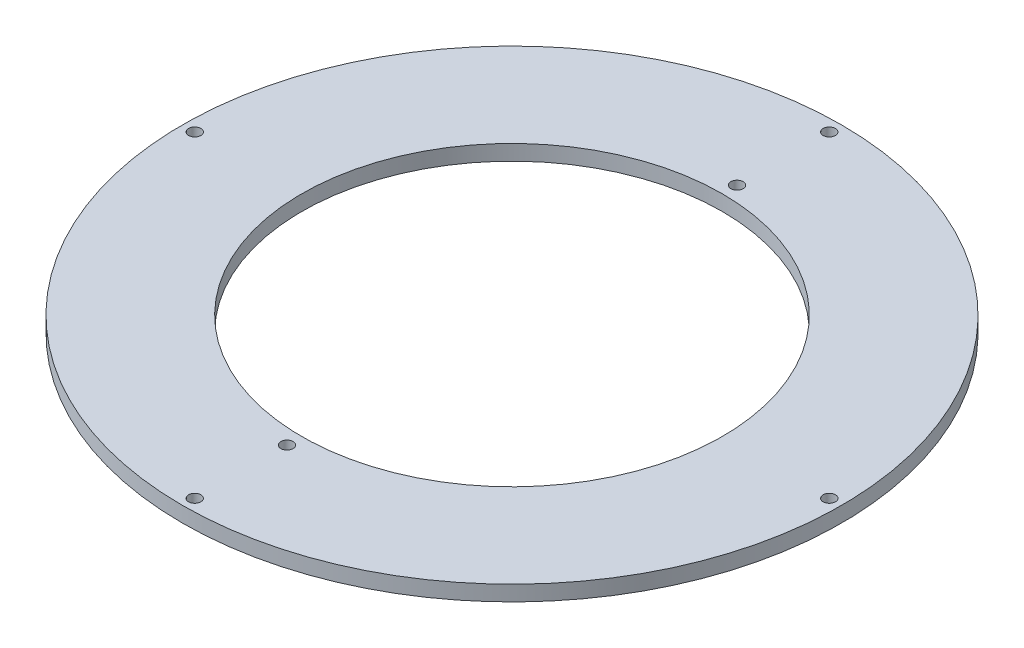
ISO-10303-21;
HEADER;
FILE_DESCRIPTION(('STEP AP214'),'2;1');
FILE_NAME('part.step','',(''),(''),'','','');
FILE_SCHEMA(('AUTOMOTIVE_DESIGN { 1 0 10303 214 1 1 1 1 }'));
ENDSEC;
DATA;
#1=APPLICATION_CONTEXT('core data for automotive mechanical design processes');
#2=APPLICATION_PROTOCOL_DEFINITION('international standard','automotive_design',2000,#1);
#3=PRODUCT_CONTEXT('',#1,'mechanical');
#4=PRODUCT('Part','Part','',(#3));
#5=PRODUCT_RELATED_PRODUCT_CATEGORY('part','',(#4));
#6=PRODUCT_DEFINITION_FORMATION('','',#4);
#7=PRODUCT_DEFINITION_CONTEXT('part definition',#1,'design');
#8=PRODUCT_DEFINITION('design','',#6,#7);
#9=PRODUCT_DEFINITION_SHAPE('','',#8);
#10=(LENGTH_UNIT() NAMED_UNIT(*) SI_UNIT(.MILLI.,.METRE.));
#11=(NAMED_UNIT(*) PLANE_ANGLE_UNIT() SI_UNIT($,.RADIAN.));
#12=(NAMED_UNIT(*) SI_UNIT($,.STERADIAN.) SOLID_ANGLE_UNIT());
#13=UNCERTAINTY_MEASURE_WITH_UNIT(LENGTH_MEASURE(1.E-05),#10,'distance_accuracy_value','');
#14=(GEOMETRIC_REPRESENTATION_CONTEXT(3) GLOBAL_UNCERTAINTY_ASSIGNED_CONTEXT((#13)) GLOBAL_UNIT_ASSIGNED_CONTEXT((#10,
#11,#12)) REPRESENTATION_CONTEXT('',''));
#15=CARTESIAN_POINT('',(0.,0.,0.));
#16=DIRECTION('',(0.,0.,1.));
#17=DIRECTION('',(1.,0.,0.));
#18=AXIS2_PLACEMENT_3D('',#15,#16,#17);
#19=CARTESIAN_POINT('',(2.13761300327242E-12,3.125,-3.76258481573311E-12));
#20=DIRECTION('',(0.,1.,0.));
#21=DIRECTION('',(0.,0.,-1.));
#22=AXIS2_PLACEMENT_3D('',#19,#20,#21);
#23=PLANE('',#22);
#24=CARTESIAN_POINT('',(0.,3.125,45.7500000000043));
#25=DIRECTION('',(0.,-1.,0.));
#26=DIRECTION('',(0.,0.,-1.));
#27=AXIS2_PLACEMENT_3D('',#24,#25,#26);
#28=CIRCLE('',#27,1.25);
#29=CARTESIAN_POINT('',(0.,3.125,44.5000000000043));
#30=VERTEX_POINT('',#29);
#31=EDGE_CURVE('E90',#30,#30,#28,.T.);
#32=ORIENTED_EDGE('',*,*,#31,.T.);
#33=EDGE_LOOP('',(#32));
#34=FACE_BOUND('',#33,.T.);
#35=CARTESIAN_POINT('',(0.,3.125,-45.7500000000043));
#36=DIRECTION('',(0.,-1.,0.));
#37=DIRECTION('',(0.,0.,1.));
#38=AXIS2_PLACEMENT_3D('',#35,#36,#37);
#39=CIRCLE('',#38,1.25);
#40=CARTESIAN_POINT('',(0.,3.125,-44.5000000000043));
#41=VERTEX_POINT('',#40);
#42=EDGE_CURVE('E87',#41,#41,#39,.T.);
#43=ORIENTED_EDGE('',*,*,#42,.T.);
#44=EDGE_LOOP('',(#43));
#45=FACE_BOUND('',#44,.T.);
#46=CARTESIAN_POINT('',(64.500000000002,3.125,-3.4402109166616E-12));
#47=DIRECTION('',(0.,-1.,0.));
#48=DIRECTION('',(0.,0.,-1.));
#49=AXIS2_PLACEMENT_3D('',#46,#47,#48);
#50=CIRCLE('',#49,1.25);
#51=CARTESIAN_POINT('',(64.500000000002,3.125,-1.25000000000344));
#52=VERTEX_POINT('',#51);
#53=EDGE_CURVE('E79',#52,#52,#50,.T.);
#54=ORIENTED_EDGE('',*,*,#53,.T.);
#55=EDGE_LOOP('',(#54));
#56=FACE_BOUND('',#55,.T.);
#57=CARTESIAN_POINT('',(1.87729606165865E-12,3.125,64.4999999999961));
#58=DIRECTION('',(0.,-1.,0.));
#59=DIRECTION('',(0.,0.,-1.));
#60=AXIS2_PLACEMENT_3D('',#57,#58,#59);
#61=CIRCLE('',#60,1.25);
#62=CARTESIAN_POINT('',(1.87729606165865E-12,3.125,63.2499999999961));
#63=VERTEX_POINT('',#62);
#64=EDGE_CURVE('E76',#63,#63,#61,.T.);
#65=ORIENTED_EDGE('',*,*,#64,.T.);
#66=EDGE_LOOP('',(#65));
#67=FACE_BOUND('',#66,.T.);
#68=CARTESIAN_POINT('',(-64.4999999999976,3.125,-4.04419840642128E-12));
#69=DIRECTION('',(0.,-1.,0.));
#70=DIRECTION('',(0.,0.,-1.));
#71=AXIS2_PLACEMENT_3D('',#68,#69,#70);
#72=CIRCLE('',#71,1.25);
#73=CARTESIAN_POINT('',(-64.4999999999976,3.125,-1.25000000000404));
#74=VERTEX_POINT('',#73);
#75=EDGE_CURVE('E70',#74,#74,#72,.T.);
#76=ORIENTED_EDGE('',*,*,#75,.T.);
#77=EDGE_LOOP('',(#76));
#78=FACE_BOUND('',#77,.T.);
#79=CARTESIAN_POINT('',(2.47339041609118E-12,3.125,-64.5000000000035));
#80=DIRECTION('',(0.,-1.,0.));
#81=DIRECTION('',(0.,0.,-1.));
#82=AXIS2_PLACEMENT_3D('',#79,#80,#81);
#83=CIRCLE('',#82,1.25);
#84=CARTESIAN_POINT('',(2.47339041609118E-12,3.125,-65.7500000000035));
#85=VERTEX_POINT('',#84);
#86=EDGE_CURVE('E63',#85,#85,#83,.T.);
#87=ORIENTED_EDGE('',*,*,#86,.T.);
#88=EDGE_LOOP('',(#87));
#89=FACE_BOUND('',#88,.T.);
#90=CARTESIAN_POINT('',(2.13761300327242E-12,3.125,-3.76258481573311E-12));
#91=DIRECTION('',(0.,-1.,0.));
#92=DIRECTION('',(0.,0.,-1.));
#93=AXIS2_PLACEMENT_3D('',#90,#91,#92);
#94=CIRCLE('',#93,66.9999999999998);
#95=CARTESIAN_POINT('',(2.13761300327242E-12,3.125,-67.0000000000036));
#96=VERTEX_POINT('',#95);
#97=EDGE_CURVE('E10',#96,#96,#94,.T.);
#98=ORIENTED_EDGE('',*,*,#97,.F.);
#99=EDGE_LOOP('',(#98));
#100=FACE_BOUND('',#99,.T.);
#101=CARTESIAN_POINT('',(2.13761300327242E-12,3.125,-3.76258481573311E-12));
#102=DIRECTION('',(0.,-1.,0.));
#103=DIRECTION('',(0.,0.,-1.));
#104=AXIS2_PLACEMENT_3D('',#101,#102,#103);
#105=CIRCLE('',#104,42.75);
#106=CARTESIAN_POINT('',(2.13761300327242E-12,3.125,-42.7500000000038));
#107=VERTEX_POINT('',#106);
#108=EDGE_CURVE('E52',#107,#107,#105,.T.);
#109=ORIENTED_EDGE('',*,*,#108,.T.);
#110=EDGE_LOOP('',(#109));
#111=FACE_BOUND('',#110,.T.);
#112=ADVANCED_FACE('F41',(#34,#45,#56,#67,#78,#89,#100,#111),#23,.T.);
#113=CARTESIAN_POINT('',(2.13761300327242E-12,0.,-3.76258481573311E-12));
#114=DIRECTION('',(0.,1.,0.));
#115=DIRECTION('',(0.,0.,-1.));
#116=AXIS2_PLACEMENT_3D('',#113,#114,#115);
#117=PLANE('',#116);
#118=CARTESIAN_POINT('',(0.,0.,45.7500000000043));
#119=DIRECTION('',(0.,-1.,0.));
#120=DIRECTION('',(0.,0.,-1.));
#121=AXIS2_PLACEMENT_3D('',#118,#119,#120);
#122=CIRCLE('',#121,1.25);
#123=CARTESIAN_POINT('',(0.,0.,44.5000000000043));
#124=VERTEX_POINT('',#123);
#125=EDGE_CURVE('E64',#124,#124,#122,.T.);
#126=ORIENTED_EDGE('',*,*,#125,.F.);
#127=EDGE_LOOP('',(#126));
#128=FACE_BOUND('',#127,.T.);
#129=CARTESIAN_POINT('',(0.,0.,-45.7500000000043));
#130=DIRECTION('',(0.,-1.,0.));
#131=DIRECTION('',(0.,0.,1.));
#132=AXIS2_PLACEMENT_3D('',#129,#130,#131);
#133=CIRCLE('',#132,1.25);
#134=CARTESIAN_POINT('',(0.,0.,-44.5000000000043));
#135=VERTEX_POINT('',#134);
#136=EDGE_CURVE('E84',#135,#135,#133,.T.);
#137=ORIENTED_EDGE('',*,*,#136,.F.);
#138=EDGE_LOOP('',(#137));
#139=FACE_BOUND('',#138,.T.);
#140=CARTESIAN_POINT('',(64.500000000002,0.,-3.4402109166616E-12));
#141=DIRECTION('',(0.,-1.,0.));
#142=DIRECTION('',(0.,0.,-1.));
#143=AXIS2_PLACEMENT_3D('',#140,#141,#142);
#144=CIRCLE('',#143,1.25);
#145=CARTESIAN_POINT('',(64.500000000002,0.,-1.25000000000344));
#146=VERTEX_POINT('',#145);
#147=EDGE_CURVE('E57',#146,#146,#144,.T.);
#148=ORIENTED_EDGE('',*,*,#147,.F.);
#149=EDGE_LOOP('',(#148));
#150=FACE_BOUND('',#149,.T.);
#151=CARTESIAN_POINT('',(1.87729606165865E-12,0.,64.4999999999961));
#152=DIRECTION('',(0.,-1.,0.));
#153=DIRECTION('',(0.,0.,-1.));
#154=AXIS2_PLACEMENT_3D('',#151,#152,#153);
#155=CIRCLE('',#154,1.25);
#156=CARTESIAN_POINT('',(1.87729606165865E-12,0.,63.2499999999961));
#157=VERTEX_POINT('',#156);
#158=EDGE_CURVE('E73',#157,#157,#155,.T.);
#159=ORIENTED_EDGE('',*,*,#158,.F.);
#160=EDGE_LOOP('',(#159));
#161=FACE_BOUND('',#160,.T.);
#162=CARTESIAN_POINT('',(-64.4999999999976,0.,-4.04419840642128E-12));
#163=DIRECTION('',(0.,-1.,0.));
#164=DIRECTION('',(0.,0.,-1.));
#165=AXIS2_PLACEMENT_3D('',#162,#163,#164);
#166=CIRCLE('',#165,1.25);
#167=CARTESIAN_POINT('',(-64.4999999999976,0.,-1.25000000000404));
#168=VERTEX_POINT('',#167);
#169=EDGE_CURVE('E67',#168,#168,#166,.T.);
#170=ORIENTED_EDGE('',*,*,#169,.F.);
#171=EDGE_LOOP('',(#170));
#172=FACE_BOUND('',#171,.T.);
#173=CARTESIAN_POINT('',(2.47339041609118E-12,0.,-64.5000000000035));
#174=DIRECTION('',(0.,-1.,0.));
#175=DIRECTION('',(0.,0.,-1.));
#176=AXIS2_PLACEMENT_3D('',#173,#174,#175);
#177=CIRCLE('',#176,1.25);
#178=CARTESIAN_POINT('',(2.47339041609118E-12,0.,-65.7500000000035));
#179=VERTEX_POINT('',#178);
#180=EDGE_CURVE('E60',#179,#179,#177,.T.);
#181=ORIENTED_EDGE('',*,*,#180,.F.);
#182=EDGE_LOOP('',(#181));
#183=FACE_BOUND('',#182,.T.);
#184=CARTESIAN_POINT('',(2.13761300327242E-12,0.,-3.76258481573311E-12));
#185=DIRECTION('',(0.,-1.,0.));
#186=DIRECTION('',(0.,0.,-1.));
#187=AXIS2_PLACEMENT_3D('',#184,#185,#186);
#188=CIRCLE('',#187,66.9999999999998);
#189=CARTESIAN_POINT('',(2.13761300327242E-12,0.,-67.0000000000036));
#190=VERTEX_POINT('',#189);
#191=EDGE_CURVE('E45',#190,#190,#188,.T.);
#192=ORIENTED_EDGE('',*,*,#191,.T.);
#193=EDGE_LOOP('',(#192));
#194=FACE_BOUND('',#193,.T.);
#195=CARTESIAN_POINT('',(2.13761300327242E-12,0.,-3.76258481573311E-12));
#196=DIRECTION('',(0.,-1.,0.));
#197=DIRECTION('',(0.,0.,-1.));
#198=AXIS2_PLACEMENT_3D('',#195,#196,#197);
#199=CIRCLE('',#198,42.75);
#200=CARTESIAN_POINT('',(2.13761300327242E-12,0.,-42.7500000000038));
#201=VERTEX_POINT('',#200);
#202=EDGE_CURVE('E54',#201,#201,#199,.T.);
#203=ORIENTED_EDGE('',*,*,#202,.F.);
#204=EDGE_LOOP('',(#203));
#205=FACE_BOUND('',#204,.T.);
#206=ADVANCED_FACE('F99',(#128,#139,#150,#161,#172,#183,#194,#205),#117,.F.);
#207=CARTESIAN_POINT('',(2.13761300327242E-12,3.125,-3.76258481573311E-12));
#208=DIRECTION('',(0.,-1.,0.));
#209=DIRECTION('',(0.,0.,1.));
#210=AXIS2_PLACEMENT_3D('',#207,#208,#209);
#211=CYLINDRICAL_SURFACE('',#210,66.9999999999998);
#212=ORIENTED_EDGE('',*,*,#97,.T.);
#213=EDGE_LOOP('',(#212));
#214=FACE_BOUND('',#213,.T.);
#215=ORIENTED_EDGE('',*,*,#191,.F.);
#216=EDGE_LOOP('',(#215));
#217=FACE_BOUND('',#216,.T.);
#218=ADVANCED_FACE('F43',(#214,#217),#211,.T.);
#219=CARTESIAN_POINT('',(2.13761300327242E-12,3.125,-3.76258481573311E-12));
#220=DIRECTION('',(0.,-1.,0.));
#221=DIRECTION('',(0.,0.,1.));
#222=AXIS2_PLACEMENT_3D('',#219,#220,#221);
#223=CYLINDRICAL_SURFACE('',#222,42.75);
#224=ORIENTED_EDGE('',*,*,#108,.F.);
#225=EDGE_LOOP('',(#224));
#226=FACE_BOUND('',#225,.T.);
#227=ORIENTED_EDGE('',*,*,#202,.T.);
#228=EDGE_LOOP('',(#227));
#229=FACE_BOUND('',#228,.T.);
#230=ADVANCED_FACE('F116',(#226,#229),#223,.F.);
#231=CARTESIAN_POINT('',(2.47339041609118E-12,0.,-64.5000000000035));
#232=DIRECTION('',(0.,1.,0.));
#233=DIRECTION('',(0.,0.,-1.));
#234=AXIS2_PLACEMENT_3D('',#231,#232,#233);
#235=CYLINDRICAL_SURFACE('',#234,1.25);
#236=ORIENTED_EDGE('',*,*,#180,.T.);
#237=EDGE_LOOP('',(#236));
#238=FACE_BOUND('',#237,.T.);
#239=ORIENTED_EDGE('',*,*,#86,.F.);
#240=EDGE_LOOP('',(#239));
#241=FACE_BOUND('',#240,.T.);
#242=ADVANCED_FACE('F118',(#238,#241),#235,.F.);
#243=CARTESIAN_POINT('',(-64.4999999999976,0.,-4.04419840642128E-12));
#244=DIRECTION('',(0.,1.,0.));
#245=DIRECTION('',(0.,0.,-1.));
#246=AXIS2_PLACEMENT_3D('',#243,#244,#245);
#247=CYLINDRICAL_SURFACE('',#246,1.25);
#248=ORIENTED_EDGE('',*,*,#169,.T.);
#249=EDGE_LOOP('',(#248));
#250=FACE_BOUND('',#249,.T.);
#251=ORIENTED_EDGE('',*,*,#75,.F.);
#252=EDGE_LOOP('',(#251));
#253=FACE_BOUND('',#252,.T.);
#254=ADVANCED_FACE('F125',(#250,#253),#247,.F.);
#255=CARTESIAN_POINT('',(1.87729606165865E-12,0.,64.4999999999961));
#256=DIRECTION('',(0.,1.,0.));
#257=DIRECTION('',(0.,0.,-1.));
#258=AXIS2_PLACEMENT_3D('',#255,#256,#257);
#259=CYLINDRICAL_SURFACE('',#258,1.25);
#260=ORIENTED_EDGE('',*,*,#158,.T.);
#261=EDGE_LOOP('',(#260));
#262=FACE_BOUND('',#261,.T.);
#263=ORIENTED_EDGE('',*,*,#64,.F.);
#264=EDGE_LOOP('',(#263));
#265=FACE_BOUND('',#264,.T.);
#266=ADVANCED_FACE('F150',(#262,#265),#259,.F.);
#267=CARTESIAN_POINT('',(64.500000000002,0.,-3.4402109166616E-12));
#268=DIRECTION('',(0.,1.,0.));
#269=DIRECTION('',(0.,0.,-1.));
#270=AXIS2_PLACEMENT_3D('',#267,#268,#269);
#271=CYLINDRICAL_SURFACE('',#270,1.25);
#272=ORIENTED_EDGE('',*,*,#147,.T.);
#273=EDGE_LOOP('',(#272));
#274=FACE_BOUND('',#273,.T.);
#275=ORIENTED_EDGE('',*,*,#53,.F.);
#276=EDGE_LOOP('',(#275));
#277=FACE_BOUND('',#276,.T.);
#278=ADVANCED_FACE('F156',(#274,#277),#271,.F.);
#279=CARTESIAN_POINT('',(0.,0.,-45.7500000000043));
#280=DIRECTION('',(0.,1.,0.));
#281=DIRECTION('',(0.,0.,-1.));
#282=AXIS2_PLACEMENT_3D('',#279,#280,#281);
#283=CYLINDRICAL_SURFACE('',#282,1.25);
#284=ORIENTED_EDGE('',*,*,#136,.T.);
#285=EDGE_LOOP('',(#284));
#286=FACE_BOUND('',#285,.T.);
#287=ORIENTED_EDGE('',*,*,#42,.F.);
#288=EDGE_LOOP('',(#287));
#289=FACE_BOUND('',#288,.T.);
#290=ADVANCED_FACE('F162',(#286,#289),#283,.F.);
#291=CARTESIAN_POINT('',(0.,0.,45.7500000000043));
#292=DIRECTION('',(0.,1.,0.));
#293=DIRECTION('',(0.,0.,-1.));
#294=AXIS2_PLACEMENT_3D('',#291,#292,#293);
#295=CYLINDRICAL_SURFACE('',#294,1.25);
#296=ORIENTED_EDGE('',*,*,#125,.T.);
#297=EDGE_LOOP('',(#296));
#298=FACE_BOUND('',#297,.T.);
#299=ORIENTED_EDGE('',*,*,#31,.F.);
#300=EDGE_LOOP('',(#299));
#301=FACE_BOUND('',#300,.T.);
#302=ADVANCED_FACE('F96',(#298,#301),#295,.F.);
#303=CLOSED_SHELL('',(#112,#206,#218,#230,#242,#254,#266,#278,#290,#302));
#304=MANIFOLD_SOLID_BREP('B2',#303);
#305=ADVANCED_BREP_SHAPE_REPRESENTATION('',(#18,#304),#14);
#306=SHAPE_DEFINITION_REPRESENTATION(#9,#305);
ENDSEC;
END-ISO-10303-21;
